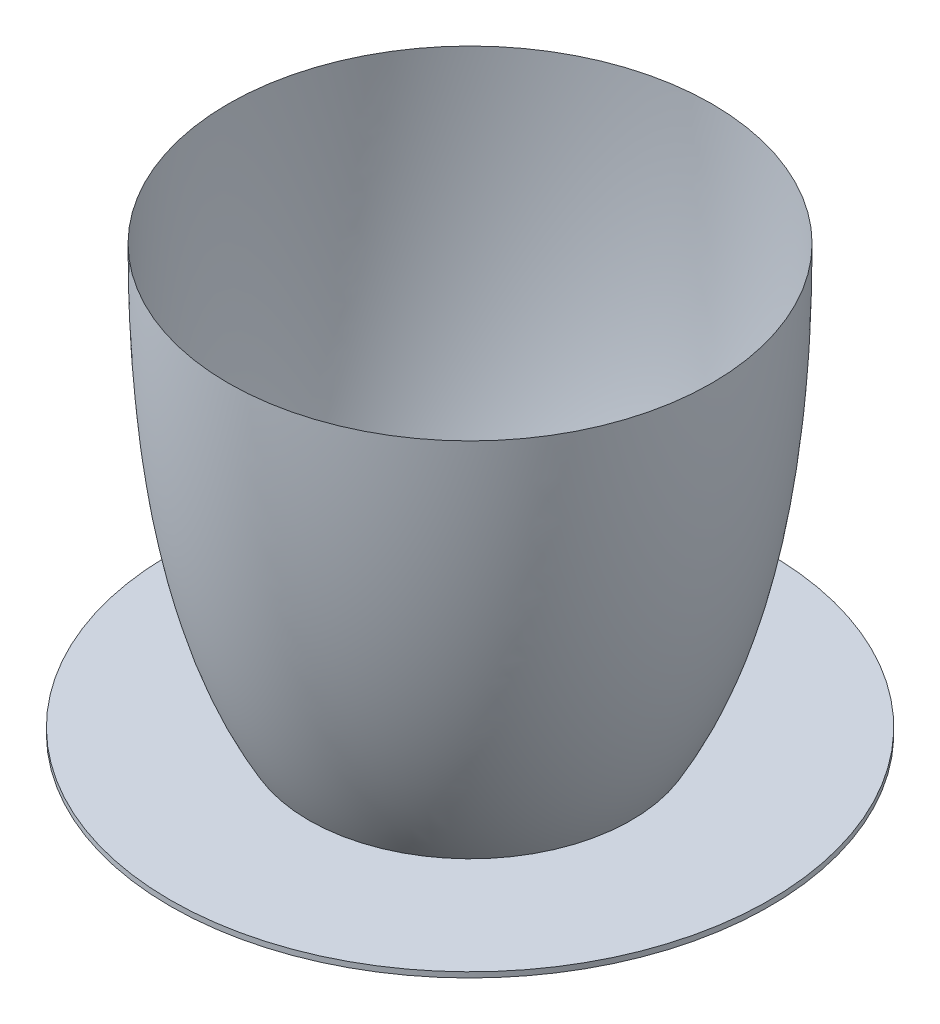
ISO-10303-21;
HEADER;
FILE_DESCRIPTION(('STEP AP214'),'2;1');
FILE_NAME('part.step','',(''),(''),'','','');
FILE_SCHEMA(('AUTOMOTIVE_DESIGN { 1 0 10303 214 1 1 1 1 }'));
ENDSEC;
DATA;
#1=APPLICATION_CONTEXT('core data for automotive mechanical design processes');
#2=APPLICATION_PROTOCOL_DEFINITION('international standard','automotive_design',2000,#1);
#3=PRODUCT_CONTEXT('',#1,'mechanical');
#4=PRODUCT('Part','Part','',(#3));
#5=PRODUCT_RELATED_PRODUCT_CATEGORY('part','',(#4));
#6=PRODUCT_DEFINITION_FORMATION('','',#4);
#7=PRODUCT_DEFINITION_CONTEXT('part definition',#1,'design');
#8=PRODUCT_DEFINITION('design','',#6,#7);
#9=PRODUCT_DEFINITION_SHAPE('','',#8);
#10=(LENGTH_UNIT() NAMED_UNIT(*) SI_UNIT(.MILLI.,.METRE.));
#11=(NAMED_UNIT(*) PLANE_ANGLE_UNIT() SI_UNIT($,.RADIAN.));
#12=(NAMED_UNIT(*) SI_UNIT($,.STERADIAN.) SOLID_ANGLE_UNIT());
#13=UNCERTAINTY_MEASURE_WITH_UNIT(LENGTH_MEASURE(1.E-05),#10,'distance_accuracy_value','');
#14=(GEOMETRIC_REPRESENTATION_CONTEXT(3) GLOBAL_UNCERTAINTY_ASSIGNED_CONTEXT((#13)) GLOBAL_UNIT_ASSIGNED_CONTEXT((#10,
#11,#12)) REPRESENTATION_CONTEXT('',''));
#15=CARTESIAN_POINT('',(0.,0.,0.));
#16=DIRECTION('',(0.,0.,1.));
#17=DIRECTION('',(1.,0.,0.));
#18=AXIS2_PLACEMENT_3D('',#15,#16,#17);
#19=CARTESIAN_POINT('',(0.,-10.,0.));
#20=DIRECTION('',(0.,1.,0.));
#21=DIRECTION('',(0.,0.,1.));
#22=AXIS2_PLACEMENT_3D('',#19,#20,#21);
#23=CYLINDRICAL_SURFACE('',#22,557.427463000615);
#24=CARTESIAN_POINT('',(0.,-10.,0.));
#25=DIRECTION('',(0.,1.,0.));
#26=DIRECTION('',(0.,0.,1.));
#27=AXIS2_PLACEMENT_3D('',#24,#25,#26);
#28=CIRCLE('',#27,557.427463000615);
#29=CARTESIAN_POINT('',(0.,-10.,557.427463000615));
#30=VERTEX_POINT('',#29);
#31=EDGE_CURVE('E11',#30,#30,#28,.T.);
#32=ORIENTED_EDGE('',*,*,#31,.T.);
#33=EDGE_LOOP('',(#32));
#34=FACE_BOUND('',#33,.T.);
#35=CARTESIAN_POINT('',(0.,0.,0.));
#36=DIRECTION('',(0.,1.,0.));
#37=DIRECTION('',(0.,0.,1.));
#38=AXIS2_PLACEMENT_3D('',#35,#36,#37);
#39=CIRCLE('',#38,557.427463000615);
#40=CARTESIAN_POINT('',(0.,0.,557.427463000615));
#41=VERTEX_POINT('',#40);
#42=EDGE_CURVE('E56',#41,#41,#39,.T.);
#43=ORIENTED_EDGE('',*,*,#42,.F.);
#44=EDGE_LOOP('',(#43));
#45=FACE_BOUND('',#44,.T.);
#46=ADVANCED_FACE('F53',(#34,#45),#23,.T.);
#47=CARTESIAN_POINT('',(0.,-10.,0.));
#48=DIRECTION('',(0.,1.,0.));
#49=DIRECTION('',(0.,0.,1.));
#50=AXIS2_PLACEMENT_3D('',#47,#48,#49);
#51=PLANE('',#50);
#52=ORIENTED_EDGE('',*,*,#31,.F.);
#53=EDGE_LOOP('',(#52));
#54=FACE_BOUND('',#53,.T.);
#55=ADVANCED_FACE('F70',(#54),#51,.F.);
#56=CARTESIAN_POINT('',(0.,0.,0.));
#57=DIRECTION('',(0.,1.,0.));
#58=DIRECTION('',(0.,0.,1.));
#59=AXIS2_PLACEMENT_3D('',#56,#57,#58);
#60=PLANE('',#59);
#61=ORIENTED_EDGE('',*,*,#42,.T.);
#62=EDGE_LOOP('',(#61));
#63=FACE_BOUND('',#62,.T.);
#64=ADVANCED_FACE('F67',(#63),#60,.T.);
#65=CLOSED_SHELL('',(#46,#55,#64));
#66=MANIFOLD_SOLID_BREP('B2',#65);
#67=CARTESIAN_POINT('',(300.,0.,0.));
#68=CARTESIAN_POINT('',(300.30411391821,0.527664720671647,0.));
#69=CARTESIAN_POINT('',(300.91373849719,1.58541763469487,0.));
#70=CARTESIAN_POINT('',(301.824959992235,3.17877194559237,0.));
#71=CARTESIAN_POINT('',(302.736498821734,4.78171334897889,0.));
#72=CARTESIAN_POINT('',(304.883422865607,8.58075899678219,0.));
#73=CARTESIAN_POINT('',(307.010131989876,12.4149145561945,0.));
#74=CARTESIAN_POINT('',(309.423476655537,16.8472933816432,0.));
#75=CARTESIAN_POINT('',(310.63873758548,19.1003807300993,0.));
#76=CARTESIAN_POINT('',(311.850995005331,21.3692918569382,0.));
#77=CARTESIAN_POINT('',(312.762401846088,23.0859444328305,0.));
#78=CARTESIAN_POINT('',(313.67378104397,24.8135333053921,0.));
#79=CARTESIAN_POINT('',(314.585159876455,26.5521456093021,0.));
#80=CARTESIAN_POINT('',(315.496499345606,28.301907457015,0.));
#81=CARTESIAN_POINT('',(316.407825914391,30.0629092104909,0.));
#82=CARTESIAN_POINT('',(317.319117837249,31.8352705059088,0.));
#83=CARTESIAN_POINT('',(318.2303841646,33.61909325603,0.));
#84=CARTESIAN_POINT('',(319.141604849807,35.4144993349907,0.));
#85=CARTESIAN_POINT('',(320.35970556148,37.8302382502451,0.));
#86=CARTESIAN_POINT('',(321.574516943325,40.2634287586972,0.));
#87=CARTESIAN_POINT('',(322.786097492829,42.7141483277055,0.));
#88=CARTESIAN_POINT('',(323.697074514683,44.5691647961683,0.));
#89=CARTESIAN_POINT('',(324.608014260962,46.4364448915621,0.));
#90=CARTESIAN_POINT('',(325.825777472291,48.9494626452115,0.));
#91=CARTESIAN_POINT('',(327.347849018736,52.1223622759724,0.));
#92=CARTESIAN_POINT('',(329.169090169794,55.9707837478414,0.));
#93=CARTESIAN_POINT('',(330.989978752052,59.8713251251425,0.));
#94=CARTESIAN_POINT('',(332.502719437576,63.1568570719924,0.));
#95=CARTESIAN_POINT('',(334.327965320738,67.1624644474373,0.));
#96=CARTESIAN_POINT('',(335.844103308212,70.5369926935311,0.));
#97=CARTESIAN_POINT('',(337.351155302502,73.9387423439264,0.));
#98=CARTESIAN_POINT('',(338.566979742778,76.7028040549276,0.));
#99=CARTESIAN_POINT('',(339.778924486102,79.4878136767373,0.));
#100=CARTESIAN_POINT('',(340.986912785457,82.2939584816129,0.));
#101=CARTESIAN_POINT('',(341.895364861035,84.4196008017661,0.));
#102=CARTESIAN_POINT('',(342.803576160937,86.5603007599896,0.));
#103=CARTESIAN_POINT('',(343.711566114507,88.7162020001102,0.));
#104=CARTESIAN_POINT('',(344.619298026888,90.8874788420288,0.));
#105=CARTESIAN_POINT('',(345.52678929069,93.0742804076498,0.));
#106=CARTESIAN_POINT('',(346.43399135734,95.2767886987141,0.));
#107=CARTESIAN_POINT('',(347.954908965177,98.9969871682665,0.));
#108=CARTESIAN_POINT('',(349.465390950397,102.748275110894,0.));
#109=CARTESIAN_POINT('',(350.965496582847,106.530758240147,0.));
#110=CARTESIAN_POINT('',(351.87078077956,108.831070528515,0.));
#111=CARTESIAN_POINT('',(352.775702833858,111.148305224822,0.));
#112=CARTESIAN_POINT('',(354.602288796862,115.862280232672,0.));
#113=CARTESIAN_POINT('',(356.40914510932,120.618775260929,0.));
#114=CARTESIAN_POINT('',(358.196418757039,125.417765941434,0.));
#115=CARTESIAN_POINT('',(359.098255204608,127.858828739992,0.));
#116=CARTESIAN_POINT('',(359.999556407102,130.318385193281,0.));
#117=CARTESIAN_POINT('',(360.900328482254,132.796633262057,0.));
#118=CARTESIAN_POINT('',(361.800520176957,135.293792138901,0.));
#119=CARTESIAN_POINT('',(362.700155519399,137.810061463504,0.));
#120=CARTESIAN_POINT('',(363.599165273185,140.345676702738,0.));
#121=CARTESIAN_POINT('',(364.497570760539,142.900839654161,0.));
#122=CARTESIAN_POINT('',(365.395303979592,145.47579056033,0.));
#123=CARTESIAN_POINT('',(366.292375219708,148.070746474211,0.));
#124=CARTESIAN_POINT('',(367.491681532894,151.569796369726,0.));
#125=CARTESIAN_POINT('',(368.685371152906,155.097896937524,0.));
#126=CARTESIAN_POINT('',(370.175629435987,159.560370807124,0.));
#127=CARTESIAN_POINT('',(371.36614456724,163.172768279302,0.));
#128=CARTESIAN_POINT('',(372.550760727768,166.815465526865,0.));
#129=CARTESIAN_POINT('',(373.441475848953,169.579073704611,0.));
#130=CARTESIAN_POINT('',(374.331244500194,172.364899426194,0.));
#131=CARTESIAN_POINT('',(375.220084769467,175.173191933281,0.));
#132=CARTESIAN_POINT('',(376.10790333109,178.004231265583,0.));
#133=CARTESIAN_POINT('',(376.994720893508,180.858279381342,0.));
#134=CARTESIAN_POINT('',(378.481944427033,185.689537198495,0.));
#135=CARTESIAN_POINT('',(380.255556493657,191.561536925068,0.));
#136=CARTESIAN_POINT('',(382.00358119684,197.489017437777,0.));
#137=CARTESIAN_POINT('',(383.170703359176,201.504750789292,0.));
#138=CARTESIAN_POINT('',(384.047996916478,204.55321875151,0.));
#139=CARTESIAN_POINT('',(384.923947066391,207.627339309615,0.));
#140=CARTESIAN_POINT('',(385.798456077457,210.727445541586,0.));
#141=CARTESIAN_POINT('',(386.671532973083,213.853844107749,0.));
#142=CARTESIAN_POINT('',(387.543086981161,217.006872558231,0.));
#143=CARTESIAN_POINT('',(388.707700913685,221.263591762671,0.));
#144=CARTESIAN_POINT('',(389.864468073789,225.558505865024,0.));
#145=CARTESIAN_POINT('',(391.013404184995,229.891990519304,0.));
#146=CARTESIAN_POINT('',(391.876723507962,233.183264294482,0.));
#147=CARTESIAN_POINT('',(392.738273212774,236.503239456102,0.));
#148=CARTESIAN_POINT('',(393.597944202199,239.852295571438,0.));
#149=CARTESIAN_POINT('',(394.746345896466,244.37541967079,0.));
#150=CARTESIAN_POINT('',(395.886037609316,248.940115104874,0.));
#151=CARTESIAN_POINT('',(397.017019791558,253.546813721814,0.));
#152=CARTESIAN_POINT('',(397.866568170319,257.046963907594,0.));
#153=CARTESIAN_POINT('',(398.713910995806,260.578522440755,0.));
#154=CARTESIAN_POINT('',(399.558965760825,264.141908007863,0.));
#155=CARTESIAN_POINT('',(400.401699480424,267.737529310754,0.));
#156=CARTESIAN_POINT('',(401.242018451925,271.365819416894,0.));
#157=CARTESIAN_POINT('',(402.079861092001,275.02720482479,0.));
#158=CARTESIAN_POINT('',(403.198372276169,279.975065262507,0.));
#159=CARTESIAN_POINT('',(404.306782470415,284.970039395206,0.));
#160=CARTESIAN_POINT('',(405.68553833987,291.301001731227,0.));
#161=CARTESIAN_POINT('',(406.782671162634,296.43657644343,0.));
#162=CARTESIAN_POINT('',(408.426899992,304.283962719002,0.));
#163=CARTESIAN_POINT('',(409.78020152446,310.918056034706,0.));
#164=CARTESIAN_POINT('',(411.110704638058,317.618686749614,0.));
#165=CARTESIAN_POINT('',(411.912688447571,321.713919630152,0.));
#166=CARTESIAN_POINT('',(413.810471541525,331.541960890536,0.));
#167=CARTESIAN_POINT('',(415.918237516457,342.949273842866,0.));
#168=CARTESIAN_POINT('',(417.94103163835,354.481826799521,0.));
#169=CARTESIAN_POINT('',(418.957754099433,360.415425748134,0.));
#170=CARTESIAN_POINT('',(419.719357564983,364.931413342051,0.));
#171=CARTESIAN_POINT('',(420.476268521828,369.492871667378,0.));
#172=CARTESIAN_POINT('',(421.484014338007,375.666342412073,0.));
#173=CARTESIAN_POINT('',(422.988055910189,385.115803127999,0.));
#174=CARTESIAN_POINT('',(424.694977055866,396.316357996967,0.));
#175=CARTESIAN_POINT('',(426.36127897742,407.752454354724,0.));
#176=CARTESIAN_POINT('',(427.531543809626,416.091553053547,0.));
#177=CARTESIAN_POINT('',(428.45540982523,422.868155481033,0.));
#178=CARTESIAN_POINT('',(429.145401011559,428.030589046047,0.));
#179=CARTESIAN_POINT('',(430.061313306223,435.023647196735,0.));
#180=CARTESIAN_POINT('',(430.958754640349,442.093147370028,0.));
#181=CARTESIAN_POINT('',(431.837508458395,449.240150507923,0.));
#182=CARTESIAN_POINT('',(432.492678905415,454.686858769155,0.));
#183=CARTESIAN_POINT('',(433.14029020629,460.193107541654,0.));
#184=CARTESIAN_POINT('',(433.780201926336,465.759822417517,0.));
#185=CARTESIAN_POINT('',(434.412144437662,471.38796476021,0.));
#186=CARTESIAN_POINT('',(435.035960213307,477.078501210525,0.));
#187=CARTESIAN_POINT('',(435.651396540226,482.832432837017,0.));
#188=CARTESIAN_POINT('',(436.258251603118,488.650766636828,0.));
#189=CARTESIAN_POINT('',(436.856259461398,494.534543635448,0.));
#190=CARTESIAN_POINT('',(437.445249784848,500.484810182923,0.));
#191=CARTESIAN_POINT('',(438.024903782012,506.502651389474,0.));
#192=CARTESIAN_POINT('',(438.595052412286,512.589158811956,0.));
#193=CARTESIAN_POINT('',(439.346379469694,520.844141068817,0.));
#194=CARTESIAN_POINT('',(440.073108644501,529.195512839364,0.));
#195=CARTESIAN_POINT('',(441.138050159177,542.016472304069,0.));
#196=CARTESIAN_POINT('',(441.982990814297,552.88962763066,0.));
#197=CARTESIAN_POINT('',(442.780463977555,563.893234778325,0.));
#198=CARTESIAN_POINT('',(443.413423622398,572.957438939314,0.));
#199=CARTESIAN_POINT('',(444.017482054997,582.13147912942,0.));
#200=CARTESIAN_POINT('',(444.890158989853,596.229225877889,0.));
#201=CARTESIAN_POINT('',(445.56684770918,608.19332453656,0.));
#202=CARTESIAN_POINT('',(446.188759853223,620.30614658959,0.));
#203=CARTESIAN_POINT('',(446.551483974076,627.753015896508,0.));
#204=CARTESIAN_POINT('',(447.017515123244,637.86910832815,0.));
#205=CARTESIAN_POINT('',(447.448705131839,648.113219201849,0.));
#206=CARTESIAN_POINT('',(447.844598911691,658.487484992169,0.));
#207=CARTESIAN_POINT('',(448.126304196533,666.416407316058,0.));
#208=CARTESIAN_POINT('',(448.480760043141,677.192880858659,0.));
#209=CARTESIAN_POINT('',(448.796436867017,688.109171796607,0.));
#210=CARTESIAN_POINT('',(449.072809907673,699.167681786126,0.));
#211=CARTESIAN_POINT('',(449.261904925003,707.623994206078,0.));
#212=CARTESIAN_POINT('',(449.488743846752,719.123451188684,0.));
#213=CARTESIAN_POINT('',(449.672330826453,730.775969673281,0.));
#214=CARTESIAN_POINT('',(449.81201553016,742.584255850263,0.));
#215=CARTESIAN_POINT('',(449.895235096721,751.618865642678,0.));
#216=CARTESIAN_POINT('',(449.95502652611,760.775789623839,0.));
#217=CARTESIAN_POINT('',(449.992940319458,770.0573777774,0.));
#218=CARTESIAN_POINT('',(449.997636137402,776.28692303967,0.));
#219=CARTESIAN_POINT('',(450.,779.42286,0.));
#220=B_SPLINE_CURVE_WITH_KNOTS('',3,(#67,#68,#69,#70,#71,#72,#73,#74,#75,#76,#77,#78,#79,#80,
#81,#82,#83,#84,#85,#86,#87,#88,#89,#90,#91,#92,#93,#94,#95,#96,#97,#98,#99,#100,#101,#102,#103,
#104,#105,#106,#107,#108,#109,#110,#111,#112,#113,#114,#115,#116,#117,#118,#119,#120,#121,#122,
#123,#124,#125,#126,#127,#128,#129,#130,#131,#132,#133,#134,#135,#136,#137,#138,#139,#140,#141,
#142,#143,#144,#145,#146,#147,#148,#149,#150,#151,#152,#153,#154,#155,#156,#157,#158,#159,#160,
#161,#162,#163,#164,#165,#166,#167,#168,#169,#170,#171,#172,#173,#174,#175,#176,#177,#178,#179,
#180,#181,#182,#183,#184,#185,#186,#187,#188,#189,#190,#191,#192,#193,#194,#195,#196,#197,#198,
#199,#200,#201,#202,#203,#204,#205,#206,#207,#208,#209,#210,#211,#212,#213,#214,#215,#216,#217,
#218,#219),.UNSPECIFIED.,.F.,.F.,(4,1,1,1,1,1,1,1,1,1,1,1,1,1,1,1,1,1,1,1,1,1,1,1,1,1,1,1,1,1,1,
1,1,1,1,1,1,1,1,1,1,1,1,1,1,1,1,1,1,1,1,1,1,1,1,1,1,1,1,1,1,1,1,1,1,1,1,1,1,1,1,1,1,1,1,1,1,1,1,
1,1,1,1,1,1,1,1,1,1,1,1,1,1,1,1,1,1,1,1,1,1,1,1,1,1,1,1,1,1,1,1,1,1,1,1,1,1,1,1,1,1,1,1,1,1,1,1,
1,1,1,1,1,1,1,1,1,1,1,1,1,1,1,1,1,1,1,1,1,1,1,4),(0.,0.0022777492293511,0.00456595976644708,
0.0068647562470513,0.00917424614361205,0.0208861362500276,0.0232622358791492,0.0280491422026595,
0.030460190742201,0.0328831444428544,0.0353181287459691,0.0377652798803868,0.0402247224587471,
0.0426965964798518,0.0451810340025148,0.0476781741853709,0.0501881518864563,0.0527111168457393,
0.0577965514922014,0.0603593229395612,0.0629356495923942,0.0655256934449898,0.0681295992864688,
0.0733796192534243,0.0786869545101329,0.084052907625084,0.0894787782797735,0.0922146102673469,
0.100515755206324,0.103314612693501,0.106129668984373,0.111809147115272,0.114673934741325,
0.11755568487583,0.120454582738396,0.123370830883751,0.126304624798656,0.1292561745624,
0.132225675113079,0.135213341828118,0.14428744765164,0.147349912888065,0.150431622472945,
0.153532801977031,0.156653696049297,0.169339008922146,0.172561981089607,0.175806095468214,
0.179071630505862,0.182358822656342,0.185667927977301,0.188999227381943,0.192352985389854,
0.19572946779569,0.199128951933741,0.202551727999529,0.20599807845577,0.212962643001323,
0.216481459982542,0.223593656765992,0.227187650489979,0.230807336243445,0.234453044165396,
0.238125076908025,0.241823785765129,0.245549486280409,0.249302546596246,0.260729289074573,
0.268490349386993,0.272414969329023,0.276369475294364,0.280354255687786,0.284369725249696,
0.288416261594457,0.292494268856531,0.296604173849273,0.304921354449068,0.30912948903849,
0.313371238498705,0.317647044769521,0.321957374065259,0.326302678521913,0.335100124025161,
0.339553224101555,0.344043232497434,0.348570659376078,0.353136012767326,0.357739819346799,
0.362382597980202,0.367064895514186,0.371787244708658,0.381354388936708,0.386200323955072,
0.396019849365241,0.400994646040926,0.416186629031774,0.421341964065132,0.426544067757696,
0.431793610424786,0.458777558700901,0.469928364140251,0.475583349835594,0.481292471918098,
0.487056527656299,0.492876346208632,0.504686670204301,0.522842009055343,0.535249449629982,
0.547908858850059,0.5543355247775,0.560828192682349,0.567387901747024,0.580712733105406,
0.587480039898777,0.594318775628888,0.601230107486887,0.608215196175346,0.615275233880683,
0.62241146954041,0.629625135742594,0.636917517646159,0.644289911863864,0.651743657636137,
0.659280100848,0.666900632385058,0.674606675030818,0.690281106945413,0.698252475242763,
0.72272182364516,0.731068710415781,0.739513585830491,0.756704239773546,0.765453563909325,
0.792339674359079,0.80152082843466,0.810814841740795,0.820223770347924,0.839394849412632,
0.849161346767105,0.859051467449766,0.869067501264717,0.889486843799784,0.899895043002562,
0.910438925158823,0.921121115424923,0.942911048424331,0.954024304281714,0.965286857850522,
0.976701659661108,0.988271675779357,1.),.UNSPECIFIED.);
#221=CARTESIAN_POINT('',(0.,0.,0.));
#222=DIRECTION('',(0.,1.,0.));
#223=AXIS1_PLACEMENT('',#221,#222);
#224=SURFACE_OF_REVOLUTION('',#220,#223);
#225=CARTESIAN_POINT('',(0.,779.42286,0.));
#226=DIRECTION('',(0.,1.,0.));
#227=DIRECTION('',(0.,0.,1.));
#228=AXIS2_PLACEMENT_3D('',#225,#226,#227);
#229=CIRCLE('',#228,450.);
#230=CARTESIAN_POINT('',(0.,779.42286,450.));
#231=VERTEX_POINT('',#230);
#232=EDGE_CURVE('E52',#231,#231,#229,.T.);
#233=ORIENTED_EDGE('',*,*,#232,.T.);
#234=EDGE_LOOP('',(#233));
#235=FACE_BOUND('',#234,.T.);
#236=CARTESIAN_POINT('',(0.,0.,0.));
#237=DIRECTION('',(0.,1.,0.));
#238=DIRECTION('',(0.,0.,1.));
#239=AXIS2_PLACEMENT_3D('',#236,#237,#238);
#240=CIRCLE('',#239,300.);
#241=CARTESIAN_POINT('',(0.,0.,300.));
#242=VERTEX_POINT('',#241);
#243=EDGE_CURVE('E101',#242,#242,#240,.T.);
#244=ORIENTED_EDGE('',*,*,#243,.F.);
#245=EDGE_LOOP('',(#244));
#246=FACE_BOUND('',#245,.T.);
#247=ADVANCED_FACE('F99',(#235,#246),#224,.F.);
#248=OPEN_SHELL('',(#247));
#249=SHELL_BASED_SURFACE_MODEL('B6',(#248));
#250=ADVANCED_BREP_SHAPE_REPRESENTATION('',(#18,#66),#14);
#251=MANIFOLD_SURFACE_SHAPE_REPRESENTATION('',(#18,#249),#14);
#252=SHAPE_REPRESENTATION('',(#18),#14);
#253=SHAPE_DEFINITION_REPRESENTATION(#9,#252);
#254=SHAPE_REPRESENTATION_RELATIONSHIP('','',#252,#250);
#255=SHAPE_REPRESENTATION_RELATIONSHIP('','',#252,#251);
ENDSEC;
END-ISO-10303-21;
